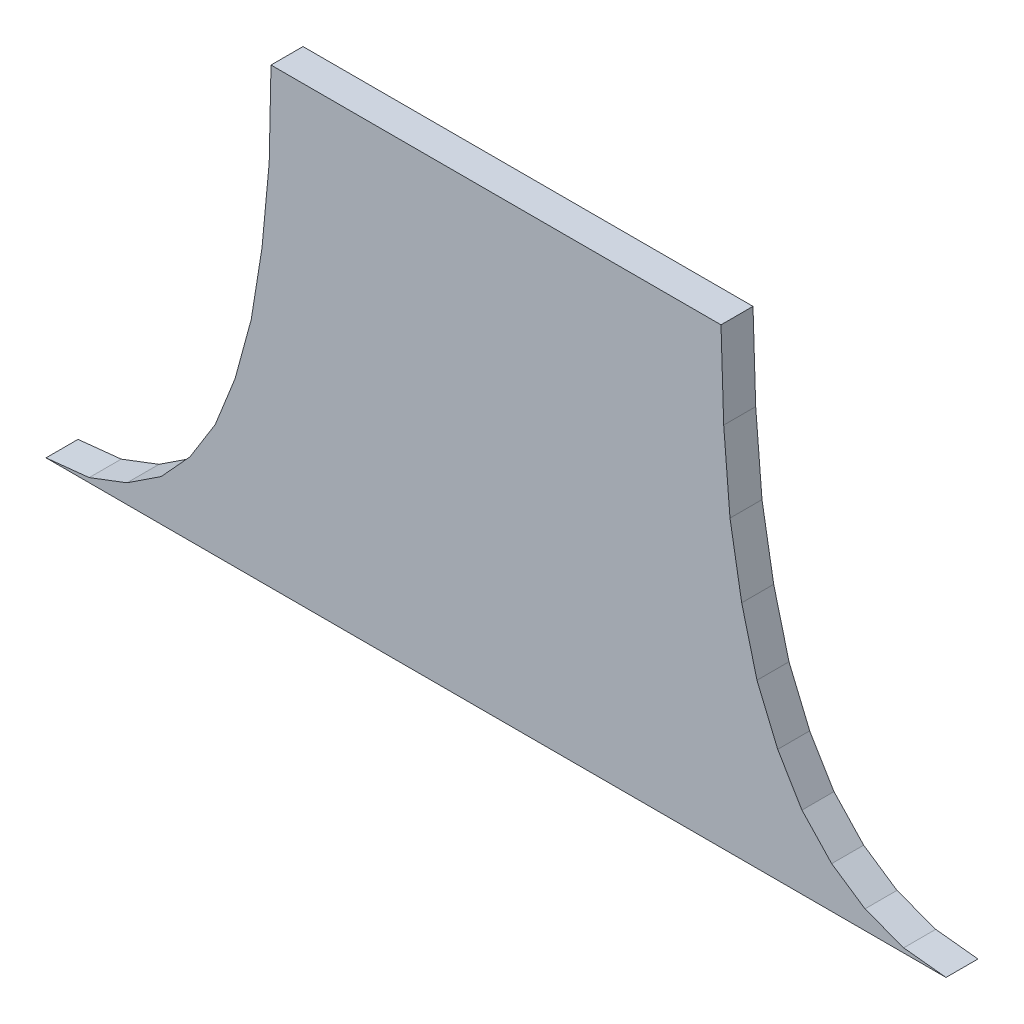
ISO-10303-21;
HEADER;
FILE_DESCRIPTION(('STEP AP214'),'2;1');
FILE_NAME('part.step','',(''),(''),'','','');
FILE_SCHEMA(('AUTOMOTIVE_DESIGN { 1 0 10303 214 1 1 1 1 }'));
ENDSEC;
DATA;
#1=APPLICATION_CONTEXT('core data for automotive mechanical design processes');
#2=APPLICATION_PROTOCOL_DEFINITION('international standard','automotive_design',2000,#1);
#3=PRODUCT_CONTEXT('',#1,'mechanical');
#4=PRODUCT('Part','Part','',(#3));
#5=PRODUCT_RELATED_PRODUCT_CATEGORY('part','',(#4));
#6=PRODUCT_DEFINITION_FORMATION('','',#4);
#7=PRODUCT_DEFINITION_CONTEXT('part definition',#1,'design');
#8=PRODUCT_DEFINITION('design','',#6,#7);
#9=PRODUCT_DEFINITION_SHAPE('','',#8);
#10=(LENGTH_UNIT() NAMED_UNIT(*) SI_UNIT(.MILLI.,.METRE.));
#11=(NAMED_UNIT(*) PLANE_ANGLE_UNIT() SI_UNIT($,.RADIAN.));
#12=(NAMED_UNIT(*) SI_UNIT($,.STERADIAN.) SOLID_ANGLE_UNIT());
#13=UNCERTAINTY_MEASURE_WITH_UNIT(LENGTH_MEASURE(1.E-05),#10,'distance_accuracy_value','');
#14=(GEOMETRIC_REPRESENTATION_CONTEXT(3) GLOBAL_UNCERTAINTY_ASSIGNED_CONTEXT((#13)) GLOBAL_UNIT_ASSIGNED_CONTEXT((#10,
#11,#12)) REPRESENTATION_CONTEXT('',''));
#15=CARTESIAN_POINT('',(0.,0.,0.));
#16=DIRECTION('',(0.,0.,1.));
#17=DIRECTION('',(1.,0.,0.));
#18=AXIS2_PLACEMENT_3D('',#15,#16,#17);
#19=CARTESIAN_POINT('',(94.1070022583008,91.9219970703125,0.));
#20=DIRECTION('',(0.999778680375206,-0.0210378294320379,0.));
#21=DIRECTION('',(-0.0210378294320379,-0.999778680375206,0.));
#22=AXIS2_PLACEMENT_3D('',#19,#20,#21);
#23=PLANE('',#22);
#24=DIRECTION('',(-0.0210378294320379,-0.999778680375206,0.));
#25=VECTOR('',#24,1.);
#26=CARTESIAN_POINT('',(94.1070022583008,91.9219970703125,0.03556));
#27=LINE('',#26,#25);
#28=CARTESIAN_POINT('',(94.1070022583008,91.9219970703125,0.03556));
#29=VERTEX_POINT('',#28);
#30=CARTESIAN_POINT('',(94.1050033569336,91.8270034790039,0.03556));
#31=VERTEX_POINT('',#30);
#32=EDGE_CURVE('E11',#29,#31,#27,.T.);
#33=ORIENTED_EDGE('',*,*,#32,.F.);
#34=DIRECTION('',(0.,0.,1.));
#35=VECTOR('',#34,1.);
#36=CARTESIAN_POINT('',(94.1070022583008,91.9219970703125,0.));
#37=LINE('',#36,#35);
#38=CARTESIAN_POINT('',(94.1070022583008,91.9219970703125,0.));
#39=VERTEX_POINT('',#38);
#40=EDGE_CURVE('E24',#39,#29,#37,.T.);
#41=ORIENTED_EDGE('',*,*,#40,.F.);
#42=DIRECTION('',(-0.0210378294320379,-0.999778680375206,0.));
#43=VECTOR('',#42,1.);
#44=CARTESIAN_POINT('',(94.1070022583008,91.9219970703125,0.));
#45=LINE('',#44,#43);
#46=CARTESIAN_POINT('',(94.1050033569336,91.8270034790039,0.));
#47=VERTEX_POINT('',#46);
#48=EDGE_CURVE('E184',#39,#47,#45,.T.);
#49=ORIENTED_EDGE('',*,*,#48,.T.);
#50=DIRECTION('',(0.,0.,1.));
#51=VECTOR('',#50,1.);
#52=CARTESIAN_POINT('',(94.1050033569336,91.8270034790039,0.));
#53=LINE('',#52,#51);
#54=EDGE_CURVE('E37',#47,#31,#53,.T.);
#55=ORIENTED_EDGE('',*,*,#54,.T.);
#56=EDGE_LOOP('',(#33,#41,#49,#55));
#57=FACE_BOUND('',#56,.T.);
#58=ADVANCED_FACE('F17',(#57),#23,.F.);
#59=CARTESIAN_POINT('',(94.1050033569336,91.8270034790039,0.));
#60=DIRECTION('',(0.995698373938176,-0.092653915928426,0.));
#61=DIRECTION('',(-0.092653915928426,-0.995698373938176,0.));
#62=AXIS2_PLACEMENT_3D('',#59,#60,#61);
#63=PLANE('',#62);
#64=DIRECTION('',(-0.092653915928426,-0.995698373938176,0.));
#65=VECTOR('',#64,1.);
#66=CARTESIAN_POINT('',(94.1050033569336,91.8270034790039,0.03556));
#67=LINE('',#66,#65);
#68=CARTESIAN_POINT('',(94.0970001220703,91.7409973144531,0.03556));
#69=VERTEX_POINT('',#68);
#70=EDGE_CURVE('E336',#31,#69,#67,.T.);
#71=ORIENTED_EDGE('',*,*,#70,.F.);
#72=ORIENTED_EDGE('',*,*,#54,.F.);
#73=DIRECTION('',(-0.092653915928426,-0.995698373938176,0.));
#74=VECTOR('',#73,1.);
#75=CARTESIAN_POINT('',(94.1050033569336,91.8270034790039,0.));
#76=LINE('',#75,#74);
#77=CARTESIAN_POINT('',(94.0970001220703,91.7409973144531,0.));
#78=VERTEX_POINT('',#77);
#79=EDGE_CURVE('E333',#47,#78,#76,.T.);
#80=ORIENTED_EDGE('',*,*,#79,.T.);
#81=DIRECTION('',(0.,0.,1.));
#82=VECTOR('',#81,1.);
#83=CARTESIAN_POINT('',(94.0970001220703,91.7409973144531,0.));
#84=LINE('',#83,#82);
#85=EDGE_CURVE('E331',#78,#69,#84,.T.);
#86=ORIENTED_EDGE('',*,*,#85,.T.);
#87=EDGE_LOOP('',(#71,#72,#80,#86));
#88=FACE_BOUND('',#87,.T.);
#89=ADVANCED_FACE('F344',(#88),#63,.F.);
#90=CARTESIAN_POINT('',(94.0970001220703,91.7409973144531,0.));
#91=DIRECTION('',(0.987437497512609,-0.158010089886809,0.));
#92=DIRECTION('',(-0.158010089886809,-0.987437497512609,0.));
#93=AXIS2_PLACEMENT_3D('',#90,#91,#92);
#94=PLANE('',#93);
#95=DIRECTION('',(-0.158010089886809,-0.987437497512609,0.));
#96=VECTOR('',#95,1.);
#97=CARTESIAN_POINT('',(94.0970001220703,91.7409973144531,0.03556));
#98=LINE('',#97,#96);
#99=CARTESIAN_POINT('',(94.0849990844727,91.6660003662109,0.03556));
#100=VERTEX_POINT('',#99);
#101=EDGE_CURVE('E328',#69,#100,#98,.T.);
#102=ORIENTED_EDGE('',*,*,#101,.F.);
#103=ORIENTED_EDGE('',*,*,#85,.F.);
#104=DIRECTION('',(-0.158010089886809,-0.987437497512609,0.));
#105=VECTOR('',#104,1.);
#106=CARTESIAN_POINT('',(94.0970001220703,91.7409973144531,0.));
#107=LINE('',#106,#105);
#108=CARTESIAN_POINT('',(94.0849990844727,91.6660003662109,0.));
#109=VERTEX_POINT('',#108);
#110=EDGE_CURVE('E325',#78,#109,#107,.T.);
#111=ORIENTED_EDGE('',*,*,#110,.T.);
#112=DIRECTION('',(0.,0.,1.));
#113=VECTOR('',#112,1.);
#114=CARTESIAN_POINT('',(94.0849990844727,91.6660003662109,0.));
#115=LINE('',#114,#113);
#116=EDGE_CURVE('E323',#109,#100,#115,.T.);
#117=ORIENTED_EDGE('',*,*,#116,.T.);
#118=EDGE_LOOP('',(#102,#103,#111,#117));
#119=FACE_BOUND('',#118,.T.);
#120=ADVANCED_FACE('F350',(#119),#94,.F.);
#121=CARTESIAN_POINT('',(94.0849990844727,91.6660003662109,0.));
#122=DIRECTION('',(0.964774114808917,-0.263079659788953,0.));
#123=DIRECTION('',(-0.263079659788953,-0.964774114808917,0.));
#124=AXIS2_PLACEMENT_3D('',#121,#122,#123);
#125=PLANE('',#124);
#126=DIRECTION('',(-0.263079659788953,-0.964774114808917,0.));
#127=VECTOR('',#126,1.);
#128=CARTESIAN_POINT('',(94.0849990844727,91.6660003662109,0.03556));
#129=LINE('',#128,#127);
#130=CARTESIAN_POINT('',(94.0670013427734,91.5999984741211,0.03556));
#131=VERTEX_POINT('',#130);
#132=EDGE_CURVE('E320',#100,#131,#129,.T.);
#133=ORIENTED_EDGE('',*,*,#132,.F.);
#134=ORIENTED_EDGE('',*,*,#116,.F.);
#135=DIRECTION('',(-0.263079659788953,-0.964774114808917,0.));
#136=VECTOR('',#135,1.);
#137=CARTESIAN_POINT('',(94.0849990844727,91.6660003662109,0.));
#138=LINE('',#137,#136);
#139=CARTESIAN_POINT('',(94.0670013427734,91.5999984741211,0.));
#140=VERTEX_POINT('',#139);
#141=EDGE_CURVE('E317',#109,#140,#138,.T.);
#142=ORIENTED_EDGE('',*,*,#141,.T.);
#143=DIRECTION('',(0.,0.,1.));
#144=VECTOR('',#143,1.);
#145=CARTESIAN_POINT('',(94.0670013427734,91.5999984741211,0.));
#146=LINE('',#145,#144);
#147=EDGE_CURVE('E315',#140,#131,#146,.T.);
#148=ORIENTED_EDGE('',*,*,#147,.T.);
#149=EDGE_LOOP('',(#133,#134,#142,#148));
#150=FACE_BOUND('',#149,.T.);
#151=ADVANCED_FACE('F352',(#150),#125,.F.);
#152=CARTESIAN_POINT('',(94.0670013427735,91.5999984741211,0.));
#153=DIRECTION('',(0.92845892545913,-0.371435086839247,0.));
#154=DIRECTION('',(-0.371435086839247,-0.92845892545913,0.));
#155=AXIS2_PLACEMENT_3D('',#152,#153,#154);
#156=PLANE('',#155);
#157=DIRECTION('',(-0.371435086839247,-0.92845892545913,0.));
#158=VECTOR('',#157,1.);
#159=CARTESIAN_POINT('',(94.0670013427734,91.5999984741211,0.03556));
#160=LINE('',#159,#158);
#161=CARTESIAN_POINT('',(94.0449981689453,91.5449981689453,0.03556));
#162=VERTEX_POINT('',#161);
#163=EDGE_CURVE('E312',#131,#162,#160,.T.);
#164=ORIENTED_EDGE('',*,*,#163,.F.);
#165=ORIENTED_EDGE('',*,*,#147,.F.);
#166=DIRECTION('',(-0.371435086839247,-0.92845892545913,0.));
#167=VECTOR('',#166,1.);
#168=CARTESIAN_POINT('',(94.0670013427734,91.5999984741211,0.));
#169=LINE('',#168,#167);
#170=CARTESIAN_POINT('',(94.0449981689453,91.5449981689453,0.));
#171=VERTEX_POINT('',#170);
#172=EDGE_CURVE('E309',#140,#171,#169,.T.);
#173=ORIENTED_EDGE('',*,*,#172,.T.);
#174=DIRECTION('',(0.,0.,1.));
#175=VECTOR('',#174,1.);
#176=CARTESIAN_POINT('',(94.0449981689453,91.5449981689453,0.));
#177=LINE('',#176,#175);
#178=EDGE_CURVE('E307',#171,#162,#177,.T.);
#179=ORIENTED_EDGE('',*,*,#178,.T.);
#180=EDGE_LOOP('',(#164,#165,#173,#179));
#181=FACE_BOUND('',#180,.T.);
#182=ADVANCED_FACE('F357',(#181),#156,.F.);
#183=CARTESIAN_POINT('',(94.0449981689453,91.5449981689453,0.));
#184=DIRECTION('',(0.849047994020397,-0.528315723644432,0.));
#185=DIRECTION('',(-0.528315723644432,-0.849047994020397,0.));
#186=AXIS2_PLACEMENT_3D('',#183,#184,#185);
#187=PLANE('',#186);
#188=DIRECTION('',(-0.528315723644432,-0.849047994020397,0.));
#189=VECTOR('',#188,1.);
#190=CARTESIAN_POINT('',(94.0449981689453,91.5449981689453,0.03556));
#191=LINE('',#190,#189);
#192=CARTESIAN_POINT('',(94.0169982910156,91.5,0.03556));
#193=VERTEX_POINT('',#192);
#194=EDGE_CURVE('E304',#162,#193,#191,.T.);
#195=ORIENTED_EDGE('',*,*,#194,.F.);
#196=ORIENTED_EDGE('',*,*,#178,.F.);
#197=DIRECTION('',(-0.528315723644432,-0.849047994020397,0.));
#198=VECTOR('',#197,1.);
#199=CARTESIAN_POINT('',(94.0449981689453,91.5449981689453,0.));
#200=LINE('',#199,#198);
#201=CARTESIAN_POINT('',(94.0169982910156,91.5,0.));
#202=VERTEX_POINT('',#201);
#203=EDGE_CURVE('E301',#171,#202,#200,.T.);
#204=ORIENTED_EDGE('',*,*,#203,.T.);
#205=DIRECTION('',(0.,0.,1.));
#206=VECTOR('',#205,1.);
#207=CARTESIAN_POINT('',(94.0169982910156,91.5,0.));
#208=LINE('',#207,#206);
#209=EDGE_CURVE('E299',#202,#193,#208,.T.);
#210=ORIENTED_EDGE('',*,*,#209,.T.);
#211=EDGE_LOOP('',(#195,#196,#204,#210));
#212=FACE_BOUND('',#211,.T.);
#213=ADVANCED_FACE('F360',(#212),#187,.F.);
#214=CARTESIAN_POINT('',(94.0169982910156,91.5,0.));
#215=DIRECTION('',(0.738088323084495,-0.674704103534519,0.));
#216=DIRECTION('',(-0.674704103534519,-0.738088323084495,0.));
#217=AXIS2_PLACEMENT_3D('',#214,#215,#216);
#218=PLANE('',#217);
#219=DIRECTION('',(-0.674704103534519,-0.738088323084495,0.));
#220=VECTOR('',#219,1.);
#221=CARTESIAN_POINT('',(94.0169982910156,91.5,0.03556));
#222=LINE('',#221,#220);
#223=CARTESIAN_POINT('',(93.9850006103516,91.4649963378906,0.03556));
#224=VERTEX_POINT('',#223);
#225=EDGE_CURVE('E296',#193,#224,#222,.T.);
#226=ORIENTED_EDGE('',*,*,#225,.F.);
#227=ORIENTED_EDGE('',*,*,#209,.F.);
#228=DIRECTION('',(-0.674704103534519,-0.738088323084495,0.));
#229=VECTOR('',#228,1.);
#230=CARTESIAN_POINT('',(94.0169982910156,91.5,0.));
#231=LINE('',#230,#229);
#232=CARTESIAN_POINT('',(93.9850006103516,91.4649963378906,0.));
#233=VERTEX_POINT('',#232);
#234=EDGE_CURVE('E293',#202,#233,#231,.T.);
#235=ORIENTED_EDGE('',*,*,#234,.T.);
#236=DIRECTION('',(0.,0.,1.));
#237=VECTOR('',#236,1.);
#238=CARTESIAN_POINT('',(93.9850006103516,91.4649963378906,0.));
#239=LINE('',#238,#237);
#240=EDGE_CURVE('E291',#233,#224,#239,.T.);
#241=ORIENTED_EDGE('',*,*,#240,.T.);
#242=EDGE_LOOP('',(#226,#227,#235,#241));
#243=FACE_BOUND('',#242,.T.);
#244=ADVANCED_FACE('F365',(#243),#218,.F.);
#245=CARTESIAN_POINT('',(93.9850006103516,91.4649963378906,0.));
#246=DIRECTION('',(0.549502510595445,-0.835492065102537,0.));
#247=DIRECTION('',(-0.835492065102537,-0.549502510595445,0.));
#248=AXIS2_PLACEMENT_3D('',#245,#246,#247);
#249=PLANE('',#248);
#250=DIRECTION('',(-0.835492065102537,-0.549502510595445,0.));
#251=VECTOR('',#250,1.);
#252=CARTESIAN_POINT('',(93.9850006103516,91.4649963378906,0.03556));
#253=LINE('',#252,#251);
#254=CARTESIAN_POINT('',(93.9469985961914,91.4400024414062,0.03556));
#255=VERTEX_POINT('',#254);
#256=EDGE_CURVE('E288',#224,#255,#253,.T.);
#257=ORIENTED_EDGE('',*,*,#256,.F.);
#258=ORIENTED_EDGE('',*,*,#240,.F.);
#259=DIRECTION('',(-0.835492065102537,-0.549502510595445,0.));
#260=VECTOR('',#259,1.);
#261=CARTESIAN_POINT('',(93.9850006103516,91.4649963378906,0.));
#262=LINE('',#261,#260);
#263=CARTESIAN_POINT('',(93.9469985961914,91.4400024414062,0.));
#264=VERTEX_POINT('',#263);
#265=EDGE_CURVE('E285',#233,#264,#262,.T.);
#266=ORIENTED_EDGE('',*,*,#265,.T.);
#267=DIRECTION('',(0.,0.,1.));
#268=VECTOR('',#267,1.);
#269=CARTESIAN_POINT('',(93.9469985961914,91.4400024414062,0.));
#270=LINE('',#269,#268);
#271=EDGE_CURVE('E283',#264,#255,#270,.T.);
#272=ORIENTED_EDGE('',*,*,#271,.T.);
#273=EDGE_LOOP('',(#257,#258,#266,#272));
#274=FACE_BOUND('',#273,.T.);
#275=ADVANCED_FACE('F368',(#274),#249,.F.);
#276=CARTESIAN_POINT('',(93.9469985961914,91.4400024414062,0.));
#277=DIRECTION('',(0.355974150268162,-0.93449580220612,0.));
#278=DIRECTION('',(-0.93449580220612,-0.355974150268162,0.));
#279=AXIS2_PLACEMENT_3D('',#276,#277,#278);
#280=PLANE('',#279);
#281=DIRECTION('',(-0.93449580220612,-0.355974150268162,0.));
#282=VECTOR('',#281,1.);
#283=CARTESIAN_POINT('',(93.9469985961914,91.4400024414062,0.03556));
#284=LINE('',#283,#282);
#285=CARTESIAN_POINT('',(93.9049987792969,91.4240036010742,0.03556));
#286=VERTEX_POINT('',#285);
#287=EDGE_CURVE('E280',#255,#286,#284,.T.);
#288=ORIENTED_EDGE('',*,*,#287,.F.);
#289=ORIENTED_EDGE('',*,*,#271,.F.);
#290=DIRECTION('',(-0.93449580220612,-0.355974150268162,0.));
#291=VECTOR('',#290,1.);
#292=CARTESIAN_POINT('',(93.9469985961914,91.4400024414062,0.));
#293=LINE('',#292,#291);
#294=CARTESIAN_POINT('',(93.9049987792969,91.4240036010742,0.));
#295=VERTEX_POINT('',#294);
#296=EDGE_CURVE('E277',#264,#295,#293,.T.);
#297=ORIENTED_EDGE('',*,*,#296,.T.);
#298=DIRECTION('',(0.,0.,1.));
#299=VECTOR('',#298,1.);
#300=CARTESIAN_POINT('',(93.9049987792969,91.4240036010742,0.));
#301=LINE('',#300,#299);
#302=EDGE_CURVE('E275',#295,#286,#301,.T.);
#303=ORIENTED_EDGE('',*,*,#302,.T.);
#304=EDGE_LOOP('',(#288,#289,#297,#303));
#305=FACE_BOUND('',#304,.T.);
#306=ADVANCED_FACE('F373',(#305),#280,.F.);
#307=CARTESIAN_POINT('',(93.9049987792969,91.4240036010742,0.));
#308=DIRECTION('',(0.103713610672371,-0.994607202347389,0.));
#309=DIRECTION('',(-0.994607202347389,-0.103713610672371,0.));
#310=AXIS2_PLACEMENT_3D('',#307,#308,#309);
#311=PLANE('',#310);
#312=DIRECTION('',(-0.994607202347389,-0.103713610672371,0.));
#313=VECTOR('',#312,1.);
#314=CARTESIAN_POINT('',(93.9049987792969,91.4240036010742,0.03556));
#315=LINE('',#314,#313);
#316=CARTESIAN_POINT('',(93.8570022583008,91.4189987182617,0.03556));
#317=VERTEX_POINT('',#316);
#318=EDGE_CURVE('E272',#286,#317,#315,.T.);
#319=ORIENTED_EDGE('',*,*,#318,.F.);
#320=ORIENTED_EDGE('',*,*,#302,.F.);
#321=DIRECTION('',(-0.994607202347389,-0.103713610672371,0.));
#322=VECTOR('',#321,1.);
#323=CARTESIAN_POINT('',(93.9049987792969,91.4240036010742,0.));
#324=LINE('',#323,#322);
#325=CARTESIAN_POINT('',(93.8570022583008,91.4189987182617,0.));
#326=VERTEX_POINT('',#325);
#327=EDGE_CURVE('E269',#295,#326,#324,.T.);
#328=ORIENTED_EDGE('',*,*,#327,.T.);
#329=DIRECTION('',(0.,0.,1.));
#330=VECTOR('',#329,1.);
#331=CARTESIAN_POINT('',(93.8570022583008,91.4189987182617,0.));
#332=LINE('',#331,#330);
#333=EDGE_CURVE('E267',#326,#317,#332,.T.);
#334=ORIENTED_EDGE('',*,*,#333,.T.);
#335=EDGE_LOOP('',(#319,#320,#328,#334));
#336=FACE_BOUND('',#335,.T.);
#337=ADVANCED_FACE('F376',(#336),#311,.F.);
#338=CARTESIAN_POINT('',(93.8570022583008,91.4189987182617,0.));
#339=DIRECTION('',(0.,1.,0.));
#340=DIRECTION('',(1.,0.,0.));
#341=AXIS2_PLACEMENT_3D('',#338,#339,#340);
#342=PLANE('',#341);
#343=DIRECTION('',(1.,0.,0.));
#344=VECTOR('',#343,1.);
#345=CARTESIAN_POINT('',(93.8570022583008,91.4189987182617,0.03556));
#346=LINE('',#345,#344);
#347=CARTESIAN_POINT('',(94.8570022583008,91.4189987182617,0.03556));
#348=VERTEX_POINT('',#347);
#349=EDGE_CURVE('E264',#317,#348,#346,.T.);
#350=ORIENTED_EDGE('',*,*,#349,.F.);
#351=ORIENTED_EDGE('',*,*,#333,.F.);
#352=DIRECTION('',(1.,0.,0.));
#353=VECTOR('',#352,1.);
#354=CARTESIAN_POINT('',(93.8570022583008,91.4189987182617,0.));
#355=LINE('',#354,#353);
#356=CARTESIAN_POINT('',(94.8570022583008,91.4189987182617,0.));
#357=VERTEX_POINT('',#356);
#358=EDGE_CURVE('E261',#326,#357,#355,.T.);
#359=ORIENTED_EDGE('',*,*,#358,.T.);
#360=DIRECTION('',(0.,0.,1.));
#361=VECTOR('',#360,1.);
#362=CARTESIAN_POINT('',(94.8570022583008,91.4189987182617,0.));
#363=LINE('',#362,#361);
#364=EDGE_CURVE('E259',#357,#348,#363,.T.);
#365=ORIENTED_EDGE('',*,*,#364,.T.);
#366=EDGE_LOOP('',(#350,#351,#359,#365));
#367=FACE_BOUND('',#366,.T.);
#368=ADVANCED_FACE('F381',(#367),#342,.F.);
#369=CARTESIAN_POINT('',(94.8570022583008,91.4189987182617,0.));
#370=DIRECTION('',(-0.105877735125924,-0.994379155656737,0.));
#371=DIRECTION('',(-0.994379155656737,0.105877735125924,0.));
#372=AXIS2_PLACEMENT_3D('',#369,#370,#371);
#373=PLANE('',#372);
#374=DIRECTION('',(-0.994379155656737,0.105877735125924,0.));
#375=VECTOR('',#374,1.);
#376=CARTESIAN_POINT('',(94.8570022583008,91.4189987182617,0.03556));
#377=LINE('',#376,#375);
#378=CARTESIAN_POINT('',(94.8099975585938,91.4240036010742,0.03556));
#379=VERTEX_POINT('',#378);
#380=EDGE_CURVE('E256',#348,#379,#377,.T.);
#381=ORIENTED_EDGE('',*,*,#380,.F.);
#382=ORIENTED_EDGE('',*,*,#364,.F.);
#383=DIRECTION('',(-0.994379155656737,0.105877735125924,0.));
#384=VECTOR('',#383,1.);
#385=CARTESIAN_POINT('',(94.8570022583008,91.4189987182617,0.));
#386=LINE('',#385,#384);
#387=CARTESIAN_POINT('',(94.8099975585938,91.4240036010742,0.));
#388=VERTEX_POINT('',#387);
#389=EDGE_CURVE('E253',#357,#388,#386,.T.);
#390=ORIENTED_EDGE('',*,*,#389,.T.);
#391=DIRECTION('',(0.,0.,1.));
#392=VECTOR('',#391,1.);
#393=CARTESIAN_POINT('',(94.8099975585938,91.4240036010742,0.));
#394=LINE('',#393,#392);
#395=EDGE_CURVE('E251',#388,#379,#394,.T.);
#396=ORIENTED_EDGE('',*,*,#395,.T.);
#397=EDGE_LOOP('',(#381,#382,#390,#396));
#398=FACE_BOUND('',#397,.T.);
#399=ADVANCED_FACE('F384',(#398),#373,.F.);
#400=CARTESIAN_POINT('',(94.8099975585938,91.4240036010742,0.));
#401=DIRECTION('',(-0.348716727153516,-0.937228170833197,0.));
#402=DIRECTION('',(-0.937228170833197,0.348716727153516,0.));
#403=AXIS2_PLACEMENT_3D('',#400,#401,#402);
#404=PLANE('',#403);
#405=DIRECTION('',(-0.937228170833197,0.348716727153516,0.));
#406=VECTOR('',#405,1.);
#407=CARTESIAN_POINT('',(94.8099975585938,91.4240036010742,0.03556));
#408=LINE('',#407,#406);
#409=CARTESIAN_POINT('',(94.7669982910156,91.4400024414062,0.03556));
#410=VERTEX_POINT('',#409);
#411=EDGE_CURVE('E248',#379,#410,#408,.T.);
#412=ORIENTED_EDGE('',*,*,#411,.F.);
#413=ORIENTED_EDGE('',*,*,#395,.F.);
#414=DIRECTION('',(-0.937228170833197,0.348716727153516,0.));
#415=VECTOR('',#414,1.);
#416=CARTESIAN_POINT('',(94.8099975585938,91.4240036010742,0.));
#417=LINE('',#416,#415);
#418=CARTESIAN_POINT('',(94.7669982910156,91.4400024414062,0.));
#419=VERTEX_POINT('',#418);
#420=EDGE_CURVE('E245',#388,#419,#417,.T.);
#421=ORIENTED_EDGE('',*,*,#420,.T.);
#422=DIRECTION('',(0.,0.,1.));
#423=VECTOR('',#422,1.);
#424=CARTESIAN_POINT('',(94.7669982910156,91.4400024414062,0.));
#425=LINE('',#424,#423);
#426=EDGE_CURVE('E243',#419,#410,#425,.T.);
#427=ORIENTED_EDGE('',*,*,#426,.T.);
#428=EDGE_LOOP('',(#412,#413,#421,#427));
#429=FACE_BOUND('',#428,.T.);
#430=ADVANCED_FACE('F389',(#429),#404,.F.);
#431=CARTESIAN_POINT('',(94.7669982910156,91.4400024414062,0.));
#432=DIRECTION('',(-0.559816189304265,-0.8286168198829,0.));
#433=DIRECTION('',(-0.8286168198829,0.559816189304265,0.));
#434=AXIS2_PLACEMENT_3D('',#431,#432,#433);
#435=PLANE('',#434);
#436=DIRECTION('',(-0.8286168198829,0.559816189304265,0.));
#437=VECTOR('',#436,1.);
#438=CARTESIAN_POINT('',(94.7669982910156,91.4400024414062,0.03556));
#439=LINE('',#438,#437);
#440=CARTESIAN_POINT('',(94.7300033569336,91.4649963378906,0.03556));
#441=VERTEX_POINT('',#440);
#442=EDGE_CURVE('E240',#410,#441,#439,.T.);
#443=ORIENTED_EDGE('',*,*,#442,.F.);
#444=ORIENTED_EDGE('',*,*,#426,.F.);
#445=DIRECTION('',(-0.8286168198829,0.559816189304265,0.));
#446=VECTOR('',#445,1.);
#447=CARTESIAN_POINT('',(94.7669982910156,91.4400024414062,0.));
#448=LINE('',#447,#446);
#449=CARTESIAN_POINT('',(94.7300033569336,91.4649963378906,0.));
#450=VERTEX_POINT('',#449);
#451=EDGE_CURVE('E237',#419,#450,#448,.T.);
#452=ORIENTED_EDGE('',*,*,#451,.T.);
#453=DIRECTION('',(0.,0.,1.));
#454=VECTOR('',#453,1.);
#455=CARTESIAN_POINT('',(94.7300033569336,91.4649963378906,0.));
#456=LINE('',#455,#454);
#457=EDGE_CURVE('E235',#450,#441,#456,.T.);
#458=ORIENTED_EDGE('',*,*,#457,.T.);
#459=EDGE_LOOP('',(#443,#444,#452,#458));
#460=FACE_BOUND('',#459,.T.);
#461=ADVANCED_FACE('F392',(#460),#435,.F.);
#462=CARTESIAN_POINT('',(94.7300033569336,91.4649963378906,0.));
#463=DIRECTION('',(-0.727575836766419,-0.686027260211754,0.));
#464=DIRECTION('',(-0.686027260211754,0.727575836766419,0.));
#465=AXIS2_PLACEMENT_3D('',#462,#463,#464);
#466=PLANE('',#465);
#467=DIRECTION('',(-0.686027260211754,0.727575836766419,0.));
#468=VECTOR('',#467,1.);
#469=CARTESIAN_POINT('',(94.7300033569336,91.4649963378906,0.03556));
#470=LINE('',#469,#468);
#471=CARTESIAN_POINT('',(94.6969985961914,91.5,0.03556));
#472=VERTEX_POINT('',#471);
#473=EDGE_CURVE('E232',#441,#472,#470,.T.);
#474=ORIENTED_EDGE('',*,*,#473,.F.);
#475=ORIENTED_EDGE('',*,*,#457,.F.);
#476=DIRECTION('',(-0.686027260211754,0.727575836766419,0.));
#477=VECTOR('',#476,1.);
#478=CARTESIAN_POINT('',(94.7300033569336,91.4649963378906,0.));
#479=LINE('',#478,#477);
#480=CARTESIAN_POINT('',(94.6969985961914,91.5,0.));
#481=VERTEX_POINT('',#480);
#482=EDGE_CURVE('E229',#450,#481,#479,.T.);
#483=ORIENTED_EDGE('',*,*,#482,.T.);
#484=DIRECTION('',(0.,0.,1.));
#485=VECTOR('',#484,1.);
#486=CARTESIAN_POINT('',(94.6969985961914,91.5,0.));
#487=LINE('',#486,#485);
#488=EDGE_CURVE('E227',#481,#472,#487,.T.);
#489=ORIENTED_EDGE('',*,*,#488,.T.);
#490=EDGE_LOOP('',(#474,#475,#483,#489));
#491=FACE_BOUND('',#490,.T.);
#492=ADVANCED_FACE('F397',(#491),#466,.F.);
#493=CARTESIAN_POINT('',(94.6969985961914,91.5,0.));
#494=DIRECTION('',(-0.857480097367235,-0.514517135398888,0.));
#495=DIRECTION('',(-0.514517135398888,0.857480097367235,0.));
#496=AXIS2_PLACEMENT_3D('',#493,#494,#495);
#497=PLANE('',#496);
#498=DIRECTION('',(-0.514517135398888,0.857480097367235,0.));
#499=VECTOR('',#498,1.);
#500=CARTESIAN_POINT('',(94.6969985961914,91.5,0.03556));
#501=LINE('',#500,#499);
#502=CARTESIAN_POINT('',(94.6699981689453,91.5449981689453,0.03556));
#503=VERTEX_POINT('',#502);
#504=EDGE_CURVE('E224',#472,#503,#501,.T.);
#505=ORIENTED_EDGE('',*,*,#504,.F.);
#506=ORIENTED_EDGE('',*,*,#488,.F.);
#507=DIRECTION('',(-0.514517135398888,0.857480097367235,0.));
#508=VECTOR('',#507,1.);
#509=CARTESIAN_POINT('',(94.6969985961914,91.5,0.));
#510=LINE('',#509,#508);
#511=CARTESIAN_POINT('',(94.6699981689453,91.5449981689453,0.));
#512=VERTEX_POINT('',#511);
#513=EDGE_CURVE('E221',#481,#512,#510,.T.);
#514=ORIENTED_EDGE('',*,*,#513,.T.);
#515=DIRECTION('',(0.,0.,1.));
#516=VECTOR('',#515,1.);
#517=CARTESIAN_POINT('',(94.6699981689453,91.5449981689453,0.));
#518=LINE('',#517,#516);
#519=EDGE_CURVE('E219',#512,#503,#518,.T.);
#520=ORIENTED_EDGE('',*,*,#519,.T.);
#521=EDGE_LOOP('',(#505,#506,#514,#520));
#522=FACE_BOUND('',#521,.T.);
#523=ADVANCED_FACE('F400',(#522),#497,.F.);
#524=CARTESIAN_POINT('',(94.6699981689453,91.5449981689453,0.));
#525=DIRECTION('',(-0.922610518944495,-0.385732848397657,0.));
#526=DIRECTION('',(-0.385732848397657,0.922610518944495,0.));
#527=AXIS2_PLACEMENT_3D('',#524,#525,#526);
#528=PLANE('',#527);
#529=DIRECTION('',(-0.385732848397657,0.922610518944495,0.));
#530=VECTOR('',#529,1.);
#531=CARTESIAN_POINT('',(94.6699981689453,91.5449981689453,0.03556));
#532=LINE('',#531,#530);
#533=CARTESIAN_POINT('',(94.6470031738281,91.5999984741211,0.03556));
#534=VERTEX_POINT('',#533);
#535=EDGE_CURVE('E216',#503,#534,#532,.T.);
#536=ORIENTED_EDGE('',*,*,#535,.F.);
#537=ORIENTED_EDGE('',*,*,#519,.F.);
#538=DIRECTION('',(-0.385732848397657,0.922610518944495,0.));
#539=VECTOR('',#538,1.);
#540=CARTESIAN_POINT('',(94.6699981689453,91.5449981689453,0.));
#541=LINE('',#540,#539);
#542=CARTESIAN_POINT('',(94.6470031738281,91.5999984741211,0.));
#543=VERTEX_POINT('',#542);
#544=EDGE_CURVE('E213',#512,#543,#541,.T.);
#545=ORIENTED_EDGE('',*,*,#544,.T.);
#546=DIRECTION('',(0.,0.,1.));
#547=VECTOR('',#546,1.);
#548=CARTESIAN_POINT('',(94.6470031738281,91.5999984741211,0.));
#549=LINE('',#548,#547);
#550=EDGE_CURVE('E211',#543,#534,#549,.T.);
#551=ORIENTED_EDGE('',*,*,#550,.T.);
#552=EDGE_LOOP('',(#536,#537,#545,#551));
#553=FACE_BOUND('',#552,.T.);
#554=ADVANCED_FACE('F405',(#553),#528,.F.);
#555=CARTESIAN_POINT('',(94.6470031738281,91.5999984741211,0.));
#556=DIRECTION('',(-0.968372482289366,-0.249508988905675,0.));
#557=DIRECTION('',(-0.249508988905675,0.968372482289366,0.));
#558=AXIS2_PLACEMENT_3D('',#555,#556,#557);
#559=PLANE('',#558);
#560=DIRECTION('',(-0.249508988905675,0.968372482289366,0.));
#561=VECTOR('',#560,1.);
#562=CARTESIAN_POINT('',(94.6470031738281,91.5999984741211,0.03556));
#563=LINE('',#562,#561);
#564=CARTESIAN_POINT('',(94.629997253418,91.6660003662109,0.03556));
#565=VERTEX_POINT('',#564);
#566=EDGE_CURVE('E208',#534,#565,#563,.T.);
#567=ORIENTED_EDGE('',*,*,#566,.F.);
#568=ORIENTED_EDGE('',*,*,#550,.F.);
#569=DIRECTION('',(-0.249508988905675,0.968372482289366,0.));
#570=VECTOR('',#569,1.);
#571=CARTESIAN_POINT('',(94.6470031738281,91.5999984741211,0.));
#572=LINE('',#571,#570);
#573=CARTESIAN_POINT('',(94.629997253418,91.6660003662109,0.));
#574=VERTEX_POINT('',#573);
#575=EDGE_CURVE('E205',#543,#574,#572,.T.);
#576=ORIENTED_EDGE('',*,*,#575,.T.);
#577=DIRECTION('',(0.,0.,1.));
#578=VECTOR('',#577,1.);
#579=CARTESIAN_POINT('',(94.629997253418,91.6660003662109,0.));
#580=LINE('',#579,#578);
#581=EDGE_CURVE('E203',#574,#565,#580,.T.);
#582=ORIENTED_EDGE('',*,*,#581,.T.);
#583=EDGE_LOOP('',(#567,#568,#576,#582));
#584=FACE_BOUND('',#583,.T.);
#585=ADVANCED_FACE('F408',(#584),#559,.F.);
#586=CARTESIAN_POINT('',(94.629997253418,91.6660003662109,0.));
#587=DIRECTION('',(-0.985305771350904,-0.170799698309455,0.));
#588=DIRECTION('',(-0.170799698309455,0.985305771350904,0.));
#589=AXIS2_PLACEMENT_3D('',#586,#587,#588);
#590=PLANE('',#589);
#591=DIRECTION('',(-0.170799698309455,0.985305771350904,0.));
#592=VECTOR('',#591,1.);
#593=CARTESIAN_POINT('',(94.629997253418,91.6660003662109,0.03556));
#594=LINE('',#593,#592);
#595=CARTESIAN_POINT('',(94.6169967651367,91.7409973144531,0.03556));
#596=VERTEX_POINT('',#595);
#597=EDGE_CURVE('E200',#565,#596,#594,.T.);
#598=ORIENTED_EDGE('',*,*,#597,.F.);
#599=ORIENTED_EDGE('',*,*,#581,.F.);
#600=DIRECTION('',(-0.170799698309455,0.985305771350904,0.));
#601=VECTOR('',#600,1.);
#602=CARTESIAN_POINT('',(94.629997253418,91.6660003662109,0.));
#603=LINE('',#602,#601);
#604=CARTESIAN_POINT('',(94.6169967651367,91.7409973144531,0.));
#605=VERTEX_POINT('',#604);
#606=EDGE_CURVE('E197',#574,#605,#603,.T.);
#607=ORIENTED_EDGE('',*,*,#606,.T.);
#608=DIRECTION('',(0.,0.,1.));
#609=VECTOR('',#608,1.);
#610=CARTESIAN_POINT('',(94.6169967651367,91.7409973144531,0.));
#611=LINE('',#610,#609);
#612=EDGE_CURVE('E195',#605,#596,#611,.T.);
#613=ORIENTED_EDGE('',*,*,#612,.T.);
#614=EDGE_LOOP('',(#598,#599,#607,#613));
#615=FACE_BOUND('',#614,.T.);
#616=ADVANCED_FACE('F413',(#615),#590,.F.);
#617=CARTESIAN_POINT('',(94.6169967651367,91.7409973144531,0.));
#618=DIRECTION('',(-0.996707840384418,-0.0810770060882207,0.));
#619=DIRECTION('',(-0.0810770060882207,0.996707840384418,0.));
#620=AXIS2_PLACEMENT_3D('',#617,#618,#619);
#621=PLANE('',#620);
#622=DIRECTION('',(-0.0810770060882207,0.996707840384418,0.));
#623=VECTOR('',#622,1.);
#624=CARTESIAN_POINT('',(94.6169967651367,91.7409973144531,0.03556));
#625=LINE('',#624,#623);
#626=CARTESIAN_POINT('',(94.6100006103516,91.8270034790039,0.03556));
#627=VERTEX_POINT('',#626);
#628=EDGE_CURVE('E192',#596,#627,#625,.T.);
#629=ORIENTED_EDGE('',*,*,#628,.F.);
#630=ORIENTED_EDGE('',*,*,#612,.F.);
#631=DIRECTION('',(-0.0810770060882207,0.996707840384418,0.));
#632=VECTOR('',#631,1.);
#633=CARTESIAN_POINT('',(94.6169967651367,91.7409973144531,0.));
#634=LINE('',#633,#632);
#635=CARTESIAN_POINT('',(94.6100006103516,91.8270034790039,0.));
#636=VERTEX_POINT('',#635);
#637=EDGE_CURVE('E190',#605,#636,#634,.T.);
#638=ORIENTED_EDGE('',*,*,#637,.T.);
#639=DIRECTION('',(0.,0.,1.));
#640=VECTOR('',#639,1.);
#641=CARTESIAN_POINT('',(94.6100006103516,91.8270034790039,0.));
#642=LINE('',#641,#640);
#643=EDGE_CURVE('E175',#636,#627,#642,.T.);
#644=ORIENTED_EDGE('',*,*,#643,.T.);
#645=EDGE_LOOP('',(#629,#630,#638,#644));
#646=FACE_BOUND('',#645,.T.);
#647=ADVANCED_FACE('F415',(#646),#621,.F.);
#648=CARTESIAN_POINT('',(94.6100006103516,91.8270034790039,0.));
#649=DIRECTION('',(-0.999502237378151,-0.0315480185759869,0.));
#650=DIRECTION('',(-0.0315480185759869,0.999502237378151,0.));
#651=AXIS2_PLACEMENT_3D('',#648,#649,#650);
#652=PLANE('',#651);
#653=DIRECTION('',(-0.0315480185759869,0.999502237378151,0.));
#654=VECTOR('',#653,1.);
#655=CARTESIAN_POINT('',(94.6100006103516,91.8270034790039,0.03556));
#656=LINE('',#655,#654);
#657=CARTESIAN_POINT('',(94.6070022583008,91.9219970703125,0.03556));
#658=VERTEX_POINT('',#657);
#659=EDGE_CURVE('E179',#627,#658,#656,.T.);
#660=ORIENTED_EDGE('',*,*,#659,.F.);
#661=ORIENTED_EDGE('',*,*,#643,.F.);
#662=DIRECTION('',(-0.0315480185759869,0.999502237378151,0.));
#663=VECTOR('',#662,1.);
#664=CARTESIAN_POINT('',(94.6100006103516,91.8270034790039,0.));
#665=LINE('',#664,#663);
#666=CARTESIAN_POINT('',(94.6070022583008,91.9219970703125,0.));
#667=VERTEX_POINT('',#666);
#668=EDGE_CURVE('E171',#636,#667,#665,.T.);
#669=ORIENTED_EDGE('',*,*,#668,.T.);
#670=DIRECTION('',(0.,0.,1.));
#671=VECTOR('',#670,1.);
#672=CARTESIAN_POINT('',(94.6070022583008,91.9219970703125,0.));
#673=LINE('',#672,#671);
#674=EDGE_CURVE('E161',#667,#658,#673,.T.);
#675=ORIENTED_EDGE('',*,*,#674,.T.);
#676=EDGE_LOOP('',(#660,#661,#669,#675));
#677=FACE_BOUND('',#676,.T.);
#678=ADVANCED_FACE('F174',(#677),#652,.F.);
#679=CARTESIAN_POINT('',(94.6070022583008,91.9219970703125,0.));
#680=DIRECTION('',(0.,-1.,0.));
#681=DIRECTION('',(-1.,0.,0.));
#682=AXIS2_PLACEMENT_3D('',#679,#680,#681);
#683=PLANE('',#682);
#684=DIRECTION('',(-1.,0.,0.));
#685=VECTOR('',#684,1.);
#686=CARTESIAN_POINT('',(94.6070022583008,91.9219970703125,0.03556));
#687=LINE('',#686,#685);
#688=EDGE_CURVE('E167',#658,#29,#687,.T.);
#689=ORIENTED_EDGE('',*,*,#688,.F.);
#690=ORIENTED_EDGE('',*,*,#674,.F.);
#691=DIRECTION('',(-1.,0.,0.));
#692=VECTOR('',#691,1.);
#693=CARTESIAN_POINT('',(94.6070022583008,91.9219970703125,0.));
#694=LINE('',#693,#692);
#695=EDGE_CURVE('E165',#667,#39,#694,.T.);
#696=ORIENTED_EDGE('',*,*,#695,.T.);
#697=ORIENTED_EDGE('',*,*,#40,.T.);
#698=EDGE_LOOP('',(#689,#690,#696,#697));
#699=FACE_BOUND('',#698,.T.);
#700=ADVANCED_FACE('F163',(#699),#683,.F.);
#701=CARTESIAN_POINT('',(94.1070022583008,91.9219970703125,0.));
#702=DIRECTION('',(0.,0.,1.));
#703=DIRECTION('',(1.,0.,0.));
#704=AXIS2_PLACEMENT_3D('',#701,#702,#703);
#705=PLANE('',#704);
#706=ORIENTED_EDGE('',*,*,#695,.F.);
#707=ORIENTED_EDGE('',*,*,#668,.F.);
#708=ORIENTED_EDGE('',*,*,#637,.F.);
#709=ORIENTED_EDGE('',*,*,#606,.F.);
#710=ORIENTED_EDGE('',*,*,#575,.F.);
#711=ORIENTED_EDGE('',*,*,#544,.F.);
#712=ORIENTED_EDGE('',*,*,#513,.F.);
#713=ORIENTED_EDGE('',*,*,#482,.F.);
#714=ORIENTED_EDGE('',*,*,#451,.F.);
#715=ORIENTED_EDGE('',*,*,#420,.F.);
#716=ORIENTED_EDGE('',*,*,#389,.F.);
#717=ORIENTED_EDGE('',*,*,#358,.F.);
#718=ORIENTED_EDGE('',*,*,#327,.F.);
#719=ORIENTED_EDGE('',*,*,#296,.F.);
#720=ORIENTED_EDGE('',*,*,#265,.F.);
#721=ORIENTED_EDGE('',*,*,#234,.F.);
#722=ORIENTED_EDGE('',*,*,#203,.F.);
#723=ORIENTED_EDGE('',*,*,#172,.F.);
#724=ORIENTED_EDGE('',*,*,#141,.F.);
#725=ORIENTED_EDGE('',*,*,#110,.F.);
#726=ORIENTED_EDGE('',*,*,#79,.F.);
#727=ORIENTED_EDGE('',*,*,#48,.F.);
#728=EDGE_LOOP('',(#706,#707,#708,#709,#710,#711,#712,#713,#714,#715,#716,#717,#718,#719,#720,
#721,#722,#723,#724,#725,#726,#727));
#729=FACE_BOUND('',#728,.T.);
#730=ADVANCED_FACE('F182',(#729),#705,.F.);
#731=CARTESIAN_POINT('',(94.1070022583008,91.9219970703125,0.03556));
#732=DIRECTION('',(0.,0.,1.));
#733=DIRECTION('',(1.,0.,0.));
#734=AXIS2_PLACEMENT_3D('',#731,#732,#733);
#735=PLANE('',#734);
#736=ORIENTED_EDGE('',*,*,#32,.T.);
#737=ORIENTED_EDGE('',*,*,#70,.T.);
#738=ORIENTED_EDGE('',*,*,#101,.T.);
#739=ORIENTED_EDGE('',*,*,#132,.T.);
#740=ORIENTED_EDGE('',*,*,#163,.T.);
#741=ORIENTED_EDGE('',*,*,#194,.T.);
#742=ORIENTED_EDGE('',*,*,#225,.T.);
#743=ORIENTED_EDGE('',*,*,#256,.T.);
#744=ORIENTED_EDGE('',*,*,#287,.T.);
#745=ORIENTED_EDGE('',*,*,#318,.T.);
#746=ORIENTED_EDGE('',*,*,#349,.T.);
#747=ORIENTED_EDGE('',*,*,#380,.T.);
#748=ORIENTED_EDGE('',*,*,#411,.T.);
#749=ORIENTED_EDGE('',*,*,#442,.T.);
#750=ORIENTED_EDGE('',*,*,#473,.T.);
#751=ORIENTED_EDGE('',*,*,#504,.T.);
#752=ORIENTED_EDGE('',*,*,#535,.T.);
#753=ORIENTED_EDGE('',*,*,#566,.T.);
#754=ORIENTED_EDGE('',*,*,#597,.T.);
#755=ORIENTED_EDGE('',*,*,#628,.T.);
#756=ORIENTED_EDGE('',*,*,#659,.T.);
#757=ORIENTED_EDGE('',*,*,#688,.T.);
#758=EDGE_LOOP('',(#736,#737,#738,#739,#740,#741,#742,#743,#744,#745,#746,#747,#748,#749,#750,
#751,#752,#753,#754,#755,#756,#757));
#759=FACE_BOUND('',#758,.T.);
#760=ADVANCED_FACE('F347',(#759),#735,.T.);
#761=CLOSED_SHELL('',(#58,#89,#120,#151,#182,#213,#244,#275,#306,#337,#368,#399,#430,#461,#492,
#523,#554,#585,#616,#647,#678,#700,#730,#760));
#762=MANIFOLD_SOLID_BREP('B1',#761);
#763=ADVANCED_BREP_SHAPE_REPRESENTATION('',(#18,#762),#14);
#764=SHAPE_DEFINITION_REPRESENTATION(#9,#763);
ENDSEC;
END-ISO-10303-21;
